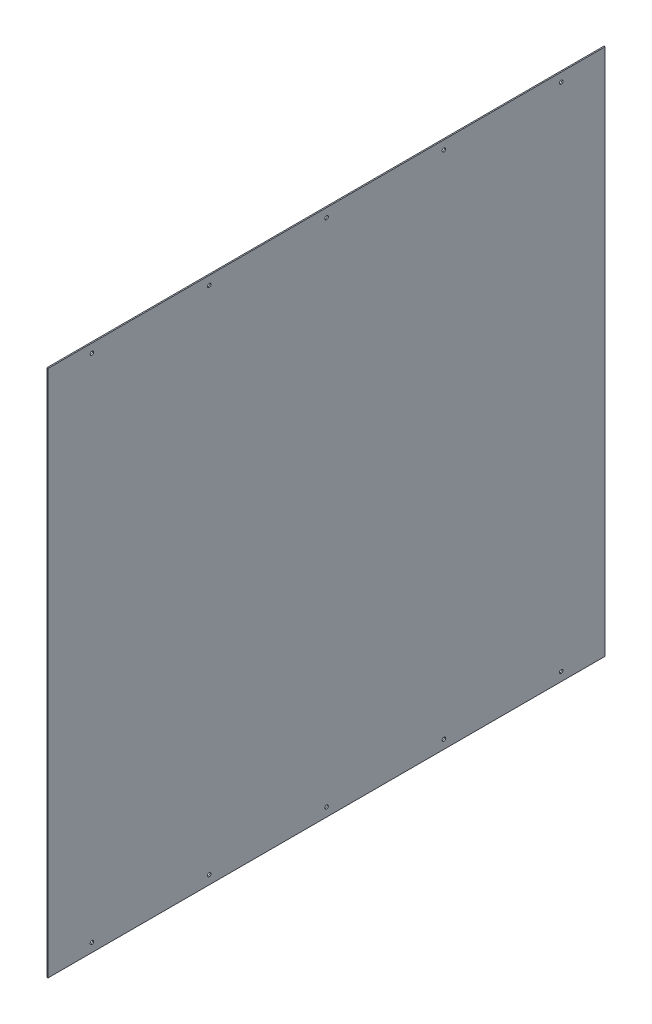
ISO-10303-21;
HEADER;
FILE_DESCRIPTION(('STEP AP214'),'2;1');
FILE_NAME('part.step','',(''),(''),'','','');
FILE_SCHEMA(('AUTOMOTIVE_DESIGN { 1 0 10303 214 1 1 1 1 }'));
ENDSEC;
DATA;
#1=APPLICATION_CONTEXT('core data for automotive mechanical design processes');
#2=APPLICATION_PROTOCOL_DEFINITION('international standard','automotive_design',2000,#1);
#3=PRODUCT_CONTEXT('',#1,'mechanical');
#4=PRODUCT('Part','Part','',(#3));
#5=PRODUCT_RELATED_PRODUCT_CATEGORY('part','',(#4));
#6=PRODUCT_DEFINITION_FORMATION('','',#4);
#7=PRODUCT_DEFINITION_CONTEXT('part definition',#1,'design');
#8=PRODUCT_DEFINITION('design','',#6,#7);
#9=PRODUCT_DEFINITION_SHAPE('','',#8);
#10=(LENGTH_UNIT() NAMED_UNIT(*) SI_UNIT(.MILLI.,.METRE.));
#11=(NAMED_UNIT(*) PLANE_ANGLE_UNIT() SI_UNIT($,.RADIAN.));
#12=(NAMED_UNIT(*) SI_UNIT($,.STERADIAN.) SOLID_ANGLE_UNIT());
#13=UNCERTAINTY_MEASURE_WITH_UNIT(LENGTH_MEASURE(1.E-05),#10,'distance_accuracy_value','');
#14=(GEOMETRIC_REPRESENTATION_CONTEXT(3) GLOBAL_UNCERTAINTY_ASSIGNED_CONTEXT((#13)) GLOBAL_UNIT_ASSIGNED_CONTEXT((#10,
#11,#12)) REPRESENTATION_CONTEXT('',''));
#15=CARTESIAN_POINT('',(0.,0.,0.));
#16=DIRECTION('',(0.,0.,1.));
#17=DIRECTION('',(1.,0.,0.));
#18=AXIS2_PLACEMENT_3D('',#15,#16,#17);
#19=CARTESIAN_POINT('',(2.,-450.,-475.));
#20=DIRECTION('',(0.,0.,1.));
#21=DIRECTION('',(1.,0.,0.));
#22=AXIS2_PLACEMENT_3D('',#19,#20,#21);
#23=PLANE('',#22);
#24=DIRECTION('',(0.,1.,0.));
#25=VECTOR('',#24,1.);
#26=CARTESIAN_POINT('',(0.,-450.,-475.));
#27=LINE('',#26,#25);
#28=CARTESIAN_POINT('',(0.,-450.,-475.));
#29=VERTEX_POINT('',#28);
#30=CARTESIAN_POINT('',(0.,450.,-475.));
#31=VERTEX_POINT('',#30);
#32=EDGE_CURVE('E99',#29,#31,#27,.T.);
#33=ORIENTED_EDGE('',*,*,#32,.T.);
#34=DIRECTION('',(-1.,0.,0.));
#35=VECTOR('',#34,1.);
#36=CARTESIAN_POINT('',(2.,450.,-475.));
#37=LINE('',#36,#35);
#38=CARTESIAN_POINT('',(2.,450.,-475.));
#39=VERTEX_POINT('',#38);
#40=EDGE_CURVE('E11',#39,#31,#37,.T.);
#41=ORIENTED_EDGE('',*,*,#40,.F.);
#42=DIRECTION('',(0.,1.,0.));
#43=VECTOR('',#42,1.);
#44=CARTESIAN_POINT('',(2.,-450.,-475.));
#45=LINE('',#44,#43);
#46=CARTESIAN_POINT('',(2.,-450.,-475.));
#47=VERTEX_POINT('',#46);
#48=EDGE_CURVE('E87',#47,#39,#45,.T.);
#49=ORIENTED_EDGE('',*,*,#48,.F.);
#50=DIRECTION('',(-1.,0.,0.));
#51=VECTOR('',#50,1.);
#52=CARTESIAN_POINT('',(2.,-450.,-475.));
#53=LINE('',#52,#51);
#54=EDGE_CURVE('E95',#47,#29,#53,.T.);
#55=ORIENTED_EDGE('',*,*,#54,.T.);
#56=EDGE_LOOP('',(#33,#41,#49,#55));
#57=FACE_BOUND('',#56,.T.);
#58=ADVANCED_FACE('F36',(#57),#23,.F.);
#59=CARTESIAN_POINT('',(2.,450.,475.));
#60=DIRECTION('',(0.,-1.,0.));
#61=DIRECTION('',(0.,0.,-1.));
#62=AXIS2_PLACEMENT_3D('',#59,#60,#61);
#63=PLANE('',#62);
#64=DIRECTION('',(0.,0.,1.));
#65=VECTOR('',#64,1.);
#66=CARTESIAN_POINT('',(0.,450.,475.));
#67=LINE('',#66,#65);
#68=CARTESIAN_POINT('',(0.,450.,475.));
#69=VERTEX_POINT('',#68);
#70=EDGE_CURVE('E91',#31,#69,#67,.T.);
#71=ORIENTED_EDGE('',*,*,#70,.T.);
#72=DIRECTION('',(-1.,0.,0.));
#73=VECTOR('',#72,1.);
#74=CARTESIAN_POINT('',(2.,450.,475.));
#75=LINE('',#74,#73);
#76=CARTESIAN_POINT('',(2.,450.,475.));
#77=VERTEX_POINT('',#76);
#78=EDGE_CURVE('E44',#77,#69,#75,.T.);
#79=ORIENTED_EDGE('',*,*,#78,.F.);
#80=DIRECTION('',(0.,0.,1.));
#81=VECTOR('',#80,1.);
#82=CARTESIAN_POINT('',(2.,450.,475.));
#83=LINE('',#82,#81);
#84=EDGE_CURVE('E82',#39,#77,#83,.T.);
#85=ORIENTED_EDGE('',*,*,#84,.F.);
#86=ORIENTED_EDGE('',*,*,#40,.T.);
#87=EDGE_LOOP('',(#71,#79,#85,#86));
#88=FACE_BOUND('',#87,.T.);
#89=ADVANCED_FACE('F90',(#88),#63,.F.);
#90=CARTESIAN_POINT('',(2.,-450.,475.));
#91=DIRECTION('',(0.,0.,-1.));
#92=DIRECTION('',(-1.,0.,0.));
#93=AXIS2_PLACEMENT_3D('',#90,#91,#92);
#94=PLANE('',#93);
#95=DIRECTION('',(0.,-1.,0.));
#96=VECTOR('',#95,1.);
#97=CARTESIAN_POINT('',(0.,-450.,475.));
#98=LINE('',#97,#96);
#99=CARTESIAN_POINT('',(0.,-450.,475.));
#100=VERTEX_POINT('',#99);
#101=EDGE_CURVE('E69',#69,#100,#98,.T.);
#102=ORIENTED_EDGE('',*,*,#101,.T.);
#103=DIRECTION('',(-1.,0.,0.));
#104=VECTOR('',#103,1.);
#105=CARTESIAN_POINT('',(2.,-450.,475.));
#106=LINE('',#105,#104);
#107=CARTESIAN_POINT('',(2.,-450.,475.));
#108=VERTEX_POINT('',#107);
#109=EDGE_CURVE('E92',#108,#100,#106,.T.);
#110=ORIENTED_EDGE('',*,*,#109,.F.);
#111=DIRECTION('',(0.,-1.,0.));
#112=VECTOR('',#111,1.);
#113=CARTESIAN_POINT('',(2.,-450.,475.));
#114=LINE('',#113,#112);
#115=EDGE_CURVE('E85',#77,#108,#114,.T.);
#116=ORIENTED_EDGE('',*,*,#115,.F.);
#117=ORIENTED_EDGE('',*,*,#78,.T.);
#118=EDGE_LOOP('',(#102,#110,#116,#117));
#119=FACE_BOUND('',#118,.T.);
#120=ADVANCED_FACE('F93',(#119),#94,.F.);
#121=CARTESIAN_POINT('',(2.,-450.,475.));
#122=DIRECTION('',(0.,1.,0.));
#123=DIRECTION('',(0.,0.,1.));
#124=AXIS2_PLACEMENT_3D('',#121,#122,#123);
#125=PLANE('',#124);
#126=DIRECTION('',(0.,0.,-1.));
#127=VECTOR('',#126,1.);
#128=CARTESIAN_POINT('',(0.,-450.,475.));
#129=LINE('',#128,#127);
#130=EDGE_CURVE('E75',#100,#29,#129,.T.);
#131=ORIENTED_EDGE('',*,*,#130,.T.);
#132=ORIENTED_EDGE('',*,*,#54,.F.);
#133=DIRECTION('',(0.,0.,-1.));
#134=VECTOR('',#133,1.);
#135=CARTESIAN_POINT('',(2.,-450.,475.));
#136=LINE('',#135,#134);
#137=EDGE_CURVE('E52',#108,#47,#136,.T.);
#138=ORIENTED_EDGE('',*,*,#137,.F.);
#139=ORIENTED_EDGE('',*,*,#109,.T.);
#140=EDGE_LOOP('',(#131,#132,#138,#139));
#141=FACE_BOUND('',#140,.T.);
#142=ADVANCED_FACE('F107',(#141),#125,.F.);
#143=CARTESIAN_POINT('',(2.,0.,0.));
#144=DIRECTION('',(-1.,0.,0.));
#145=DIRECTION('',(0.,0.,1.));
#146=AXIS2_PLACEMENT_3D('',#143,#144,#145);
#147=PLANE('',#146);
#148=CARTESIAN_POINT('',(2.,-435.,400.));
#149=DIRECTION('',(1.,0.,0.));
#150=DIRECTION('',(0.,0.,1.));
#151=AXIS2_PLACEMENT_3D('',#148,#149,#150);
#152=CIRCLE('',#151,2.99999999999999);
#153=CARTESIAN_POINT('',(2.,-435.,403.));
#154=VERTEX_POINT('',#153);
#155=EDGE_CURVE('E119',#154,#154,#152,.T.);
#156=ORIENTED_EDGE('',*,*,#155,.F.);
#157=EDGE_LOOP('',(#156));
#158=FACE_BOUND('',#157,.T.);
#159=CARTESIAN_POINT('',(2.,-435.,-400.));
#160=DIRECTION('',(1.,0.,0.));
#161=DIRECTION('',(0.,0.,1.));
#162=AXIS2_PLACEMENT_3D('',#159,#160,#161);
#163=CIRCLE('',#162,2.99999999999999);
#164=CARTESIAN_POINT('',(2.,-435.,-397.));
#165=VERTEX_POINT('',#164);
#166=EDGE_CURVE('E133',#165,#165,#163,.T.);
#167=ORIENTED_EDGE('',*,*,#166,.F.);
#168=EDGE_LOOP('',(#167));
#169=FACE_BOUND('',#168,.T.);
#170=CARTESIAN_POINT('',(2.,-435.,2.77555756156289E-13));
#171=DIRECTION('',(1.,0.,0.));
#172=DIRECTION('',(0.,0.,1.));
#173=AXIS2_PLACEMENT_3D('',#170,#171,#172);
#174=CIRCLE('',#173,3.);
#175=CARTESIAN_POINT('',(2.,-435.,3.00000000000027));
#176=VERTEX_POINT('',#175);
#177=EDGE_CURVE('E126',#176,#176,#174,.T.);
#178=ORIENTED_EDGE('',*,*,#177,.F.);
#179=EDGE_LOOP('',(#178));
#180=FACE_BOUND('',#179,.T.);
#181=CARTESIAN_POINT('',(2.,-435.,-200.));
#182=DIRECTION('',(1.,0.,0.));
#183=DIRECTION('',(0.,0.,1.));
#184=AXIS2_PLACEMENT_3D('',#181,#182,#183);
#185=CIRCLE('',#184,2.99999999999999);
#186=CARTESIAN_POINT('',(2.,-435.,-197.));
#187=VERTEX_POINT('',#186);
#188=EDGE_CURVE('E145',#187,#187,#185,.T.);
#189=ORIENTED_EDGE('',*,*,#188,.F.);
#190=EDGE_LOOP('',(#189));
#191=FACE_BOUND('',#190,.T.);
#192=CARTESIAN_POINT('',(2.,-435.,200.));
#193=DIRECTION('',(1.,0.,0.));
#194=DIRECTION('',(0.,0.,1.));
#195=AXIS2_PLACEMENT_3D('',#192,#193,#194);
#196=CIRCLE('',#195,2.99999999999999);
#197=CARTESIAN_POINT('',(2.,-435.,203.));
#198=VERTEX_POINT('',#197);
#199=EDGE_CURVE('E125',#198,#198,#196,.T.);
#200=ORIENTED_EDGE('',*,*,#199,.F.);
#201=EDGE_LOOP('',(#200));
#202=FACE_BOUND('',#201,.T.);
#203=CARTESIAN_POINT('',(2.,435.,-400.));
#204=DIRECTION('',(1.,0.,0.));
#205=DIRECTION('',(0.,0.,-1.));
#206=AXIS2_PLACEMENT_3D('',#203,#204,#205);
#207=CIRCLE('',#206,2.99999999999999);
#208=CARTESIAN_POINT('',(2.,435.,-403.));
#209=VERTEX_POINT('',#208);
#210=EDGE_CURVE('E139',#209,#209,#207,.T.);
#211=ORIENTED_EDGE('',*,*,#210,.F.);
#212=EDGE_LOOP('',(#211));
#213=FACE_BOUND('',#212,.T.);
#214=CARTESIAN_POINT('',(2.,435.,-200.));
#215=DIRECTION('',(1.,0.,0.));
#216=DIRECTION('',(0.,0.,-1.));
#217=AXIS2_PLACEMENT_3D('',#214,#215,#216);
#218=CIRCLE('',#217,2.99999999999999);
#219=CARTESIAN_POINT('',(2.,435.,-203.));
#220=VERTEX_POINT('',#219);
#221=EDGE_CURVE('E155',#220,#220,#218,.T.);
#222=ORIENTED_EDGE('',*,*,#221,.F.);
#223=EDGE_LOOP('',(#222));
#224=FACE_BOUND('',#223,.T.);
#225=CARTESIAN_POINT('',(2.,435.,2.77555756156289E-13));
#226=DIRECTION('',(1.,0.,0.));
#227=DIRECTION('',(0.,0.,-1.));
#228=AXIS2_PLACEMENT_3D('',#225,#226,#227);
#229=CIRCLE('',#228,3.);
#230=CARTESIAN_POINT('',(2.,435.,-2.99999999999972));
#231=VERTEX_POINT('',#230);
#232=EDGE_CURVE('E161',#231,#231,#229,.T.);
#233=ORIENTED_EDGE('',*,*,#232,.F.);
#234=EDGE_LOOP('',(#233));
#235=FACE_BOUND('',#234,.T.);
#236=CARTESIAN_POINT('',(2.,435.,200.));
#237=DIRECTION('',(1.,0.,0.));
#238=DIRECTION('',(0.,0.,-1.));
#239=AXIS2_PLACEMENT_3D('',#236,#237,#238);
#240=CIRCLE('',#239,2.99999999999999);
#241=CARTESIAN_POINT('',(2.,435.,197.));
#242=VERTEX_POINT('',#241);
#243=EDGE_CURVE('E167',#242,#242,#240,.T.);
#244=ORIENTED_EDGE('',*,*,#243,.F.);
#245=EDGE_LOOP('',(#244));
#246=FACE_BOUND('',#245,.T.);
#247=CARTESIAN_POINT('',(2.,435.,400.));
#248=DIRECTION('',(1.,0.,0.));
#249=DIRECTION('',(0.,0.,-1.));
#250=AXIS2_PLACEMENT_3D('',#247,#248,#249);
#251=CIRCLE('',#250,2.99999999999999);
#252=CARTESIAN_POINT('',(2.,435.,397.));
#253=VERTEX_POINT('',#252);
#254=EDGE_CURVE('E113',#253,#253,#251,.T.);
#255=ORIENTED_EDGE('',*,*,#254,.F.);
#256=EDGE_LOOP('',(#255));
#257=FACE_BOUND('',#256,.T.);
#258=ORIENTED_EDGE('',*,*,#48,.T.);
#259=ORIENTED_EDGE('',*,*,#84,.T.);
#260=ORIENTED_EDGE('',*,*,#115,.T.);
#261=ORIENTED_EDGE('',*,*,#137,.T.);
#262=EDGE_LOOP('',(#258,#259,#260,#261));
#263=FACE_BOUND('',#262,.T.);
#264=ADVANCED_FACE('F83',(#158,#169,#180,#191,#202,#213,#224,#235,#246,#257,#263),#147,.F.);
#265=CARTESIAN_POINT('',(0.,0.,0.));
#266=DIRECTION('',(-1.,0.,0.));
#267=DIRECTION('',(0.,0.,1.));
#268=AXIS2_PLACEMENT_3D('',#265,#266,#267);
#269=PLANE('',#268);
#270=CARTESIAN_POINT('',(0.,-435.,400.));
#271=DIRECTION('',(1.,0.,0.));
#272=DIRECTION('',(0.,0.,1.));
#273=AXIS2_PLACEMENT_3D('',#270,#271,#272);
#274=CIRCLE('',#273,2.99999999999999);
#275=CARTESIAN_POINT('',(0.,-435.,403.));
#276=VERTEX_POINT('',#275);
#277=EDGE_CURVE('E122',#276,#276,#274,.T.);
#278=ORIENTED_EDGE('',*,*,#277,.T.);
#279=EDGE_LOOP('',(#278));
#280=FACE_BOUND('',#279,.T.);
#281=CARTESIAN_POINT('',(0.,-435.,-400.));
#282=DIRECTION('',(1.,0.,0.));
#283=DIRECTION('',(0.,0.,1.));
#284=AXIS2_PLACEMENT_3D('',#281,#282,#283);
#285=CIRCLE('',#284,2.99999999999999);
#286=CARTESIAN_POINT('',(0.,-435.,-397.));
#287=VERTEX_POINT('',#286);
#288=EDGE_CURVE('E136',#287,#287,#285,.T.);
#289=ORIENTED_EDGE('',*,*,#288,.T.);
#290=EDGE_LOOP('',(#289));
#291=FACE_BOUND('',#290,.T.);
#292=CARTESIAN_POINT('',(0.,-435.,2.77555756156289E-13));
#293=DIRECTION('',(1.,0.,0.));
#294=DIRECTION('',(0.,0.,1.));
#295=AXIS2_PLACEMENT_3D('',#292,#293,#294);
#296=CIRCLE('',#295,3.);
#297=CARTESIAN_POINT('',(0.,-435.,3.00000000000027));
#298=VERTEX_POINT('',#297);
#299=EDGE_CURVE('E129',#298,#298,#296,.T.);
#300=ORIENTED_EDGE('',*,*,#299,.T.);
#301=EDGE_LOOP('',(#300));
#302=FACE_BOUND('',#301,.T.);
#303=CARTESIAN_POINT('',(0.,-435.,-200.));
#304=DIRECTION('',(1.,0.,0.));
#305=DIRECTION('',(0.,0.,1.));
#306=AXIS2_PLACEMENT_3D('',#303,#304,#305);
#307=CIRCLE('',#306,2.99999999999999);
#308=CARTESIAN_POINT('',(0.,-435.,-197.));
#309=VERTEX_POINT('',#308);
#310=EDGE_CURVE('E130',#309,#309,#307,.T.);
#311=ORIENTED_EDGE('',*,*,#310,.T.);
#312=EDGE_LOOP('',(#311));
#313=FACE_BOUND('',#312,.T.);
#314=CARTESIAN_POINT('',(0.,-435.,200.));
#315=DIRECTION('',(1.,0.,0.));
#316=DIRECTION('',(0.,0.,1.));
#317=AXIS2_PLACEMENT_3D('',#314,#315,#316);
#318=CIRCLE('',#317,2.99999999999999);
#319=CARTESIAN_POINT('',(0.,-435.,203.));
#320=VERTEX_POINT('',#319);
#321=EDGE_CURVE('E142',#320,#320,#318,.T.);
#322=ORIENTED_EDGE('',*,*,#321,.T.);
#323=EDGE_LOOP('',(#322));
#324=FACE_BOUND('',#323,.T.);
#325=CARTESIAN_POINT('',(0.,435.,-400.));
#326=DIRECTION('',(1.,0.,0.));
#327=DIRECTION('',(0.,0.,-1.));
#328=AXIS2_PLACEMENT_3D('',#325,#326,#327);
#329=CIRCLE('',#328,2.99999999999999);
#330=CARTESIAN_POINT('',(0.,435.,-403.));
#331=VERTEX_POINT('',#330);
#332=EDGE_CURVE('E152',#331,#331,#329,.T.);
#333=ORIENTED_EDGE('',*,*,#332,.T.);
#334=EDGE_LOOP('',(#333));
#335=FACE_BOUND('',#334,.T.);
#336=CARTESIAN_POINT('',(0.,435.,-200.));
#337=DIRECTION('',(1.,0.,0.));
#338=DIRECTION('',(0.,0.,-1.));
#339=AXIS2_PLACEMENT_3D('',#336,#337,#338);
#340=CIRCLE('',#339,2.99999999999999);
#341=CARTESIAN_POINT('',(0.,435.,-203.));
#342=VERTEX_POINT('',#341);
#343=EDGE_CURVE('E158',#342,#342,#340,.T.);
#344=ORIENTED_EDGE('',*,*,#343,.T.);
#345=EDGE_LOOP('',(#344));
#346=FACE_BOUND('',#345,.T.);
#347=CARTESIAN_POINT('',(0.,435.,2.77555756156289E-13));
#348=DIRECTION('',(1.,0.,0.));
#349=DIRECTION('',(0.,0.,-1.));
#350=AXIS2_PLACEMENT_3D('',#347,#348,#349);
#351=CIRCLE('',#350,3.);
#352=CARTESIAN_POINT('',(0.,435.,-2.99999999999972));
#353=VERTEX_POINT('',#352);
#354=EDGE_CURVE('E164',#353,#353,#351,.T.);
#355=ORIENTED_EDGE('',*,*,#354,.T.);
#356=EDGE_LOOP('',(#355));
#357=FACE_BOUND('',#356,.T.);
#358=CARTESIAN_POINT('',(0.,435.,200.));
#359=DIRECTION('',(1.,0.,0.));
#360=DIRECTION('',(0.,0.,-1.));
#361=AXIS2_PLACEMENT_3D('',#358,#359,#360);
#362=CIRCLE('',#361,2.99999999999999);
#363=CARTESIAN_POINT('',(0.,435.,197.));
#364=VERTEX_POINT('',#363);
#365=EDGE_CURVE('E116',#364,#364,#362,.T.);
#366=ORIENTED_EDGE('',*,*,#365,.T.);
#367=EDGE_LOOP('',(#366));
#368=FACE_BOUND('',#367,.T.);
#369=CARTESIAN_POINT('',(0.,435.,400.));
#370=DIRECTION('',(1.,0.,0.));
#371=DIRECTION('',(0.,0.,-1.));
#372=AXIS2_PLACEMENT_3D('',#369,#370,#371);
#373=CIRCLE('',#372,2.99999999999999);
#374=CARTESIAN_POINT('',(0.,435.,397.));
#375=VERTEX_POINT('',#374);
#376=EDGE_CURVE('E102',#375,#375,#373,.T.);
#377=ORIENTED_EDGE('',*,*,#376,.T.);
#378=EDGE_LOOP('',(#377));
#379=FACE_BOUND('',#378,.T.);
#380=ORIENTED_EDGE('',*,*,#32,.F.);
#381=ORIENTED_EDGE('',*,*,#130,.F.);
#382=ORIENTED_EDGE('',*,*,#101,.F.);
#383=ORIENTED_EDGE('',*,*,#70,.F.);
#384=EDGE_LOOP('',(#380,#381,#382,#383));
#385=FACE_BOUND('',#384,.T.);
#386=ADVANCED_FACE('F110',(#280,#291,#302,#313,#324,#335,#346,#357,#368,#379,#385),#269,.T.);
#387=CARTESIAN_POINT('',(0.,435.,400.));
#388=DIRECTION('',(1.,0.,0.));
#389=DIRECTION('',(0.,0.,-1.));
#390=AXIS2_PLACEMENT_3D('',#387,#388,#389);
#391=CYLINDRICAL_SURFACE('',#390,2.99999999999999);
#392=ORIENTED_EDGE('',*,*,#376,.F.);
#393=EDGE_LOOP('',(#392));
#394=FACE_BOUND('',#393,.T.);
#395=ORIENTED_EDGE('',*,*,#254,.T.);
#396=EDGE_LOOP('',(#395));
#397=FACE_BOUND('',#396,.T.);
#398=ADVANCED_FACE('F179',(#394,#397),#391,.F.);
#399=CARTESIAN_POINT('',(0.,435.,200.));
#400=DIRECTION('',(1.,0.,0.));
#401=DIRECTION('',(0.,0.,-1.));
#402=AXIS2_PLACEMENT_3D('',#399,#400,#401);
#403=CYLINDRICAL_SURFACE('',#402,2.99999999999999);
#404=ORIENTED_EDGE('',*,*,#365,.F.);
#405=EDGE_LOOP('',(#404));
#406=FACE_BOUND('',#405,.T.);
#407=ORIENTED_EDGE('',*,*,#243,.T.);
#408=EDGE_LOOP('',(#407));
#409=FACE_BOUND('',#408,.T.);
#410=ADVANCED_FACE('F175',(#406,#409),#403,.F.);
#411=CARTESIAN_POINT('',(0.,435.,2.77555756156289E-13));
#412=DIRECTION('',(1.,0.,0.));
#413=DIRECTION('',(0.,0.,-1.));
#414=AXIS2_PLACEMENT_3D('',#411,#412,#413);
#415=CYLINDRICAL_SURFACE('',#414,3.);
#416=ORIENTED_EDGE('',*,*,#354,.F.);
#417=EDGE_LOOP('',(#416));
#418=FACE_BOUND('',#417,.T.);
#419=ORIENTED_EDGE('',*,*,#232,.T.);
#420=EDGE_LOOP('',(#419));
#421=FACE_BOUND('',#420,.T.);
#422=ADVANCED_FACE('F178',(#418,#421),#415,.F.);
#423=CARTESIAN_POINT('',(0.,435.,-200.));
#424=DIRECTION('',(1.,0.,0.));
#425=DIRECTION('',(0.,0.,-1.));
#426=AXIS2_PLACEMENT_3D('',#423,#424,#425);
#427=CYLINDRICAL_SURFACE('',#426,2.99999999999999);
#428=ORIENTED_EDGE('',*,*,#343,.F.);
#429=EDGE_LOOP('',(#428));
#430=FACE_BOUND('',#429,.T.);
#431=ORIENTED_EDGE('',*,*,#221,.T.);
#432=EDGE_LOOP('',(#431));
#433=FACE_BOUND('',#432,.T.);
#434=ADVANCED_FACE('F240',(#430,#433),#427,.F.);
#435=CARTESIAN_POINT('',(0.,435.,-400.));
#436=DIRECTION('',(1.,0.,0.));
#437=DIRECTION('',(0.,0.,-1.));
#438=AXIS2_PLACEMENT_3D('',#435,#436,#437);
#439=CYLINDRICAL_SURFACE('',#438,2.99999999999999);
#440=ORIENTED_EDGE('',*,*,#332,.F.);
#441=EDGE_LOOP('',(#440));
#442=FACE_BOUND('',#441,.T.);
#443=ORIENTED_EDGE('',*,*,#210,.T.);
#444=EDGE_LOOP('',(#443));
#445=FACE_BOUND('',#444,.T.);
#446=ADVANCED_FACE('F250',(#442,#445),#439,.F.);
#447=CARTESIAN_POINT('',(0.,-435.,200.));
#448=DIRECTION('',(1.,0.,0.));
#449=DIRECTION('',(0.,0.,-1.));
#450=AXIS2_PLACEMENT_3D('',#447,#448,#449);
#451=CYLINDRICAL_SURFACE('',#450,2.99999999999999);
#452=ORIENTED_EDGE('',*,*,#321,.F.);
#453=EDGE_LOOP('',(#452));
#454=FACE_BOUND('',#453,.T.);
#455=ORIENTED_EDGE('',*,*,#199,.T.);
#456=EDGE_LOOP('',(#455));
#457=FACE_BOUND('',#456,.T.);
#458=ADVANCED_FACE('F260',(#454,#457),#451,.F.);
#459=CARTESIAN_POINT('',(0.,-435.,-200.));
#460=DIRECTION('',(1.,0.,0.));
#461=DIRECTION('',(0.,0.,-1.));
#462=AXIS2_PLACEMENT_3D('',#459,#460,#461);
#463=CYLINDRICAL_SURFACE('',#462,2.99999999999999);
#464=ORIENTED_EDGE('',*,*,#310,.F.);
#465=EDGE_LOOP('',(#464));
#466=FACE_BOUND('',#465,.T.);
#467=ORIENTED_EDGE('',*,*,#188,.T.);
#468=EDGE_LOOP('',(#467));
#469=FACE_BOUND('',#468,.T.);
#470=ADVANCED_FACE('F270',(#466,#469),#463,.F.);
#471=CARTESIAN_POINT('',(0.,-435.,2.77555756156289E-13));
#472=DIRECTION('',(1.,0.,0.));
#473=DIRECTION('',(0.,0.,-1.));
#474=AXIS2_PLACEMENT_3D('',#471,#472,#473);
#475=CYLINDRICAL_SURFACE('',#474,3.);
#476=ORIENTED_EDGE('',*,*,#299,.F.);
#477=EDGE_LOOP('',(#476));
#478=FACE_BOUND('',#477,.T.);
#479=ORIENTED_EDGE('',*,*,#177,.T.);
#480=EDGE_LOOP('',(#479));
#481=FACE_BOUND('',#480,.T.);
#482=ADVANCED_FACE('F280',(#478,#481),#475,.F.);
#483=CARTESIAN_POINT('',(0.,-435.,-400.));
#484=DIRECTION('',(1.,0.,0.));
#485=DIRECTION('',(0.,0.,-1.));
#486=AXIS2_PLACEMENT_3D('',#483,#484,#485);
#487=CYLINDRICAL_SURFACE('',#486,2.99999999999999);
#488=ORIENTED_EDGE('',*,*,#288,.F.);
#489=EDGE_LOOP('',(#488));
#490=FACE_BOUND('',#489,.T.);
#491=ORIENTED_EDGE('',*,*,#166,.T.);
#492=EDGE_LOOP('',(#491));
#493=FACE_BOUND('',#492,.T.);
#494=ADVANCED_FACE('F290',(#490,#493),#487,.F.);
#495=CARTESIAN_POINT('',(0.,-435.,400.));
#496=DIRECTION('',(1.,0.,0.));
#497=DIRECTION('',(0.,0.,-1.));
#498=AXIS2_PLACEMENT_3D('',#495,#496,#497);
#499=CYLINDRICAL_SURFACE('',#498,2.99999999999999);
#500=ORIENTED_EDGE('',*,*,#277,.F.);
#501=EDGE_LOOP('',(#500));
#502=FACE_BOUND('',#501,.T.);
#503=ORIENTED_EDGE('',*,*,#155,.T.);
#504=EDGE_LOOP('',(#503));
#505=FACE_BOUND('',#504,.T.);
#506=ADVANCED_FACE('F300',(#502,#505),#499,.F.);
#507=CLOSED_SHELL('',(#58,#89,#120,#142,#264,#386,#398,#410,#422,#434,#446,#458,#470,#482,#494,#506));
#508=MANIFOLD_SOLID_BREP('B2',#507);
#509=ADVANCED_BREP_SHAPE_REPRESENTATION('',(#18,#508),#14);
#510=SHAPE_DEFINITION_REPRESENTATION(#9,#509);
ENDSEC;
END-ISO-10303-21;
